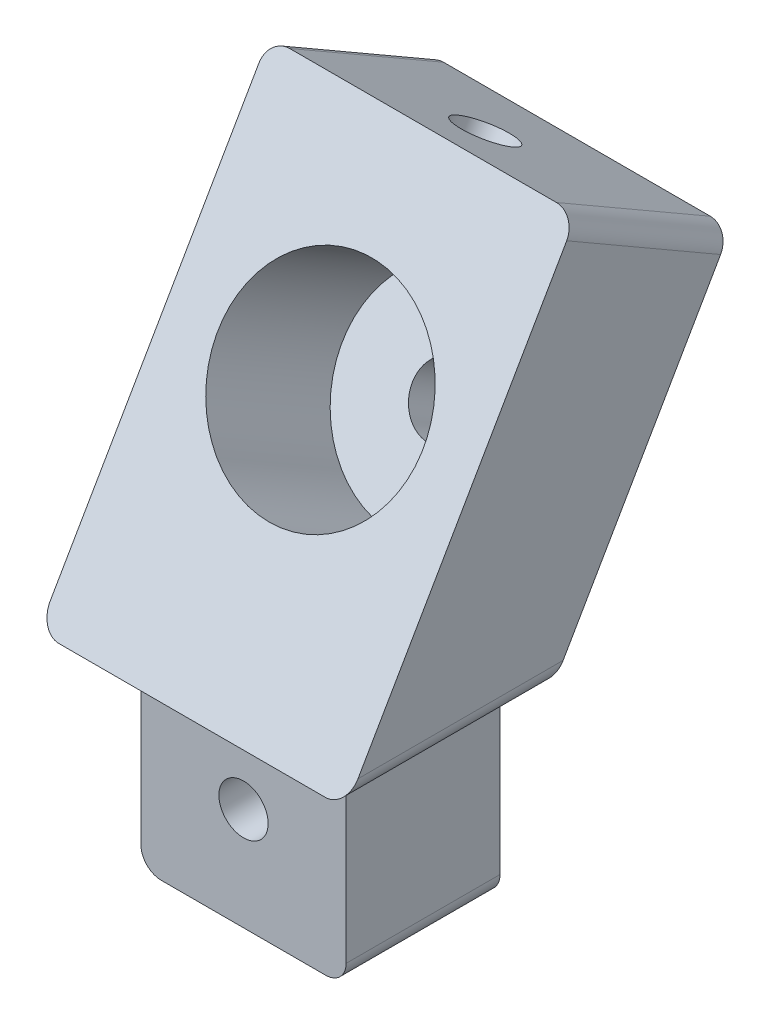
ISO-10303-21;
HEADER;
FILE_DESCRIPTION(('STEP AP214'),'2;1');
FILE_NAME('part.step','',(''),(''),'','','');
FILE_SCHEMA(('AUTOMOTIVE_DESIGN { 1 0 10303 214 1 1 1 1 }'));
ENDSEC;
DATA;
#1=APPLICATION_CONTEXT('core data for automotive mechanical design processes');
#2=APPLICATION_PROTOCOL_DEFINITION('international standard','automotive_design',2000,#1);
#3=PRODUCT_CONTEXT('',#1,'mechanical');
#4=PRODUCT('Part','Part','',(#3));
#5=PRODUCT_RELATED_PRODUCT_CATEGORY('part','',(#4));
#6=PRODUCT_DEFINITION_FORMATION('','',#4);
#7=PRODUCT_DEFINITION_CONTEXT('part definition',#1,'design');
#8=PRODUCT_DEFINITION('design','',#6,#7);
#9=PRODUCT_DEFINITION_SHAPE('','',#8);
#10=(LENGTH_UNIT() NAMED_UNIT(*) SI_UNIT(.MILLI.,.METRE.));
#11=(NAMED_UNIT(*) PLANE_ANGLE_UNIT() SI_UNIT($,.RADIAN.));
#12=(NAMED_UNIT(*) SI_UNIT($,.STERADIAN.) SOLID_ANGLE_UNIT());
#13=UNCERTAINTY_MEASURE_WITH_UNIT(LENGTH_MEASURE(1.E-05),#10,'distance_accuracy_value','');
#14=(GEOMETRIC_REPRESENTATION_CONTEXT(3) GLOBAL_UNCERTAINTY_ASSIGNED_CONTEXT((#13)) GLOBAL_UNIT_ASSIGNED_CONTEXT((#10,
#11,#12)) REPRESENTATION_CONTEXT('',''));
#15=CARTESIAN_POINT('',(0.,0.,0.));
#16=DIRECTION('',(0.,0.,1.));
#17=DIRECTION('',(1.,0.,0.));
#18=AXIS2_PLACEMENT_3D('',#15,#16,#17);
#19=CARTESIAN_POINT('',(5.,-5.,3.75));
#20=DIRECTION('',(-1.,0.,0.));
#21=DIRECTION('',(0.,0.,1.));
#22=AXIS2_PLACEMENT_3D('',#19,#20,#21);
#23=PLANE('',#22);
#24=DIRECTION('',(0.,1.,0.));
#25=VECTOR('',#24,1.);
#26=CARTESIAN_POINT('',(5.,-5.,3.75));
#27=LINE('',#26,#25);
#28=CARTESIAN_POINT('',(5.,-4.,3.75));
#29=VERTEX_POINT('',#28);
#30=CARTESIAN_POINT('',(5.,4.,3.75));
#31=VERTEX_POINT('',#30);
#32=EDGE_CURVE('E236',#29,#31,#27,.T.);
#33=ORIENTED_EDGE('',*,*,#32,.F.);
#34=DIRECTION('',(0.,0.,-1.));
#35=VECTOR('',#34,1.);
#36=CARTESIAN_POINT('',(5.,-4.,3.75));
#37=LINE('',#36,#35);
#38=CARTESIAN_POINT('',(5.,-4.,-3.75));
#39=VERTEX_POINT('',#38);
#40=EDGE_CURVE('E333',#29,#39,#37,.T.);
#41=ORIENTED_EDGE('',*,*,#40,.T.);
#42=DIRECTION('',(0.,1.,0.));
#43=VECTOR('',#42,1.);
#44=CARTESIAN_POINT('',(5.,-5.,-3.75));
#45=LINE('',#44,#43);
#46=CARTESIAN_POINT('',(5.,4.,-3.75));
#47=VERTEX_POINT('',#46);
#48=EDGE_CURVE('E230',#39,#47,#45,.T.);
#49=ORIENTED_EDGE('',*,*,#48,.T.);
#50=DIRECTION('',(0.,0.,-1.));
#51=VECTOR('',#50,1.);
#52=CARTESIAN_POINT('',(5.,4.,3.75));
#53=LINE('',#52,#51);
#54=EDGE_CURVE('E317',#47,#31,#53,.F.);
#55=ORIENTED_EDGE('',*,*,#54,.T.);
#56=EDGE_LOOP('',(#33,#41,#49,#55));
#57=FACE_BOUND('',#56,.T.);
#58=ADVANCED_FACE('F39',(#57),#23,.F.);
#59=CARTESIAN_POINT('',(-5.,-5.,3.75));
#60=DIRECTION('',(1.,0.,0.));
#61=DIRECTION('',(0.,0.,-1.));
#62=AXIS2_PLACEMENT_3D('',#59,#60,#61);
#63=PLANE('',#62);
#64=DIRECTION('',(0.,-1.,0.));
#65=VECTOR('',#64,1.);
#66=CARTESIAN_POINT('',(-5.,-5.,-3.75));
#67=LINE('',#66,#65);
#68=CARTESIAN_POINT('',(-5.,4.,-3.75));
#69=VERTEX_POINT('',#68);
#70=CARTESIAN_POINT('',(-5.,-4.,-3.75));
#71=VERTEX_POINT('',#70);
#72=EDGE_CURVE('E255',#69,#71,#67,.T.);
#73=ORIENTED_EDGE('',*,*,#72,.T.);
#74=DIRECTION('',(0.,0.,-1.));
#75=VECTOR('',#74,1.);
#76=CARTESIAN_POINT('',(-5.,-4.,3.75));
#77=LINE('',#76,#75);
#78=CARTESIAN_POINT('',(-5.,-4.,3.75));
#79=VERTEX_POINT('',#78);
#80=EDGE_CURVE('E356',#71,#79,#77,.F.);
#81=ORIENTED_EDGE('',*,*,#80,.T.);
#82=DIRECTION('',(0.,-1.,0.));
#83=VECTOR('',#82,1.);
#84=CARTESIAN_POINT('',(-5.,-5.,3.75));
#85=LINE('',#84,#83);
#86=CARTESIAN_POINT('',(-5.,4.,3.75));
#87=VERTEX_POINT('',#86);
#88=EDGE_CURVE('E240',#87,#79,#85,.T.);
#89=ORIENTED_EDGE('',*,*,#88,.F.);
#90=DIRECTION('',(0.,0.,-1.));
#91=VECTOR('',#90,1.);
#92=CARTESIAN_POINT('',(-5.,4.,-3.75));
#93=LINE('',#92,#91);
#94=EDGE_CURVE('E321',#87,#69,#93,.T.);
#95=ORIENTED_EDGE('',*,*,#94,.T.);
#96=EDGE_LOOP('',(#73,#81,#89,#95));
#97=FACE_BOUND('',#96,.T.);
#98=ADVANCED_FACE('F520',(#97),#63,.F.);
#99=CARTESIAN_POINT('',(-5.,-5.,3.75));
#100=DIRECTION('',(0.,1.,0.));
#101=DIRECTION('',(0.,0.,1.));
#102=AXIS2_PLACEMENT_3D('',#99,#100,#101);
#103=PLANE('',#102);
#104=DIRECTION('',(1.,0.,0.));
#105=VECTOR('',#104,1.);
#106=CARTESIAN_POINT('',(-5.,-5.,-3.75));
#107=LINE('',#106,#105);
#108=CARTESIAN_POINT('',(-4.,-5.,-3.75));
#109=VERTEX_POINT('',#108);
#110=CARTESIAN_POINT('',(4.,-5.,-3.75));
#111=VERTEX_POINT('',#110);
#112=EDGE_CURVE('E241',#109,#111,#107,.T.);
#113=ORIENTED_EDGE('',*,*,#112,.T.);
#114=DIRECTION('',(0.,0.,-1.));
#115=VECTOR('',#114,1.);
#116=CARTESIAN_POINT('',(4.,-5.,3.75));
#117=LINE('',#116,#115);
#118=CARTESIAN_POINT('',(4.,-5.,3.75));
#119=VERTEX_POINT('',#118);
#120=EDGE_CURVE('E347',#111,#119,#117,.F.);
#121=ORIENTED_EDGE('',*,*,#120,.T.);
#122=DIRECTION('',(1.,0.,0.));
#123=VECTOR('',#122,1.);
#124=CARTESIAN_POINT('',(-5.,-5.,3.75));
#125=LINE('',#124,#123);
#126=CARTESIAN_POINT('',(-4.,-5.,3.75));
#127=VERTEX_POINT('',#126);
#128=EDGE_CURVE('E245',#127,#119,#125,.T.);
#129=ORIENTED_EDGE('',*,*,#128,.F.);
#130=DIRECTION('',(0.,0.,-1.));
#131=VECTOR('',#130,1.);
#132=CARTESIAN_POINT('',(-4.,-5.,3.75));
#133=LINE('',#132,#131);
#134=EDGE_CURVE('E343',#127,#109,#133,.T.);
#135=ORIENTED_EDGE('',*,*,#134,.T.);
#136=EDGE_LOOP('',(#113,#121,#129,#135));
#137=FACE_BOUND('',#136,.T.);
#138=ADVANCED_FACE('F513',(#137),#103,.F.);
#139=CARTESIAN_POINT('',(0.,0.,3.75));
#140=DIRECTION('',(0.,0.,-1.));
#141=DIRECTION('',(-1.,0.,0.));
#142=AXIS2_PLACEMENT_3D('',#139,#140,#141);
#143=PLANE('',#142);
#144=CARTESIAN_POINT('',(0.,0.,3.75));
#145=DIRECTION('',(0.,0.,1.));
#146=DIRECTION('',(1.,0.,0.));
#147=AXIS2_PLACEMENT_3D('',#144,#145,#146);
#148=CIRCLE('',#147,1.2);
#149=CARTESIAN_POINT('',(1.2,0.,3.75));
#150=VERTEX_POINT('',#149);
#151=EDGE_CURVE('E425',#150,#150,#148,.T.);
#152=ORIENTED_EDGE('',*,*,#151,.F.);
#153=EDGE_LOOP('',(#152));
#154=FACE_BOUND('',#153,.T.);
#155=ORIENTED_EDGE('',*,*,#32,.T.);
#156=DIRECTION('',(-1.,0.,0.));
#157=VECTOR('',#156,1.);
#158=CARTESIAN_POINT('',(-6.,4.,3.75));
#159=LINE('',#158,#157);
#160=EDGE_CURVE('E359',#31,#87,#159,.T.);
#161=ORIENTED_EDGE('',*,*,#160,.T.);
#162=ORIENTED_EDGE('',*,*,#88,.T.);
#163=CARTESIAN_POINT('',(-4.,-4.,3.75));
#164=DIRECTION('',(0.,0.,-1.));
#165=DIRECTION('',(-1.,0.,0.));
#166=AXIS2_PLACEMENT_3D('',#163,#164,#165);
#167=CIRCLE('',#166,1.);
#168=EDGE_CURVE('E350',#79,#127,#167,.F.);
#169=ORIENTED_EDGE('',*,*,#168,.T.);
#170=ORIENTED_EDGE('',*,*,#128,.T.);
#171=CARTESIAN_POINT('',(4.,-4.,3.75));
#172=DIRECTION('',(0.,0.,-1.));
#173=DIRECTION('',(-1.,0.,0.));
#174=AXIS2_PLACEMENT_3D('',#171,#172,#173);
#175=CIRCLE('',#174,1.);
#176=EDGE_CURVE('E353',#119,#29,#175,.F.);
#177=ORIENTED_EDGE('',*,*,#176,.T.);
#178=EDGE_LOOP('',(#155,#161,#162,#169,#170,#177));
#179=FACE_BOUND('',#178,.T.);
#180=ADVANCED_FACE('F510',(#154,#179),#143,.F.);
#181=CARTESIAN_POINT('',(0.,0.,-3.75));
#182=DIRECTION('',(0.,0.,-1.));
#183=DIRECTION('',(-1.,0.,0.));
#184=AXIS2_PLACEMENT_3D('',#181,#182,#183);
#185=PLANE('',#184);
#186=DIRECTION('',(0.,1.,0.));
#187=VECTOR('',#186,1.);
#188=CARTESIAN_POINT('',(-3.25,-3.25,-3.75));
#189=LINE('',#188,#187);
#190=CARTESIAN_POINT('',(-3.25,-3.25,-3.75));
#191=VERTEX_POINT('',#190);
#192=CARTESIAN_POINT('',(-3.25,3.25,-3.75));
#193=VERTEX_POINT('',#192);
#194=EDGE_CURVE('E185',#191,#193,#189,.T.);
#195=ORIENTED_EDGE('',*,*,#194,.F.);
#196=DIRECTION('',(-1.,0.,0.));
#197=VECTOR('',#196,1.);
#198=CARTESIAN_POINT('',(3.25,-3.25,-3.75));
#199=LINE('',#198,#197);
#200=CARTESIAN_POINT('',(3.25,-3.25,-3.75));
#201=VERTEX_POINT('',#200);
#202=EDGE_CURVE('E205',#201,#191,#199,.T.);
#203=ORIENTED_EDGE('',*,*,#202,.F.);
#204=DIRECTION('',(0.,-1.,0.));
#205=VECTOR('',#204,1.);
#206=CARTESIAN_POINT('',(3.25,-3.25,-3.75));
#207=LINE('',#206,#205);
#208=CARTESIAN_POINT('',(3.25,3.25,-3.75));
#209=VERTEX_POINT('',#208);
#210=EDGE_CURVE('E209',#209,#201,#207,.T.);
#211=ORIENTED_EDGE('',*,*,#210,.F.);
#212=DIRECTION('',(1.,0.,0.));
#213=VECTOR('',#212,1.);
#214=CARTESIAN_POINT('',(3.25,3.25,-3.75));
#215=LINE('',#214,#213);
#216=EDGE_CURVE('E221',#193,#209,#215,.T.);
#217=ORIENTED_EDGE('',*,*,#216,.F.);
#218=EDGE_LOOP('',(#195,#203,#211,#217));
#219=FACE_BOUND('',#218,.T.);
#220=ORIENTED_EDGE('',*,*,#48,.F.);
#221=CARTESIAN_POINT('',(4.,-4.,-3.75));
#222=DIRECTION('',(0.,0.,-1.));
#223=DIRECTION('',(-1.,0.,0.));
#224=AXIS2_PLACEMENT_3D('',#221,#222,#223);
#225=CIRCLE('',#224,1.);
#226=EDGE_CURVE('E340',#39,#111,#225,.T.);
#227=ORIENTED_EDGE('',*,*,#226,.T.);
#228=ORIENTED_EDGE('',*,*,#112,.F.);
#229=CARTESIAN_POINT('',(-4.,-4.,-3.75));
#230=DIRECTION('',(0.,0.,-1.));
#231=DIRECTION('',(-1.,0.,0.));
#232=AXIS2_PLACEMENT_3D('',#229,#230,#231);
#233=CIRCLE('',#232,1.);
#234=EDGE_CURVE('E337',#109,#71,#233,.T.);
#235=ORIENTED_EDGE('',*,*,#234,.T.);
#236=ORIENTED_EDGE('',*,*,#72,.F.);
#237=CARTESIAN_POINT('',(-6.,4.,-3.75));
#238=DIRECTION('',(0.,0.,-1.));
#239=DIRECTION('',(-1.,0.,0.));
#240=AXIS2_PLACEMENT_3D('',#237,#238,#239);
#241=CIRCLE('',#240,1.);
#242=CARTESIAN_POINT('',(-6.,5.,-3.75));
#243=VERTEX_POINT('',#242);
#244=EDGE_CURVE('E329',#69,#243,#241,.F.);
#245=ORIENTED_EDGE('',*,*,#244,.T.);
#246=DIRECTION('',(-1.,0.,0.));
#247=VECTOR('',#246,1.);
#248=CARTESIAN_POINT('',(-5.,5.,-3.75));
#249=LINE('',#248,#247);
#250=CARTESIAN_POINT('',(6.,5.,-3.75));
#251=VERTEX_POINT('',#250);
#252=EDGE_CURVE('E252',#251,#243,#249,.T.);
#253=ORIENTED_EDGE('',*,*,#252,.F.);
#254=CARTESIAN_POINT('',(6.,4.,-3.75));
#255=DIRECTION('',(0.,0.,-1.));
#256=DIRECTION('',(-1.,0.,0.));
#257=AXIS2_PLACEMENT_3D('',#254,#255,#256);
#258=CIRCLE('',#257,1.);
#259=EDGE_CURVE('E325',#251,#47,#258,.F.);
#260=ORIENTED_EDGE('',*,*,#259,.T.);
#261=EDGE_LOOP('',(#220,#227,#228,#235,#236,#245,#253,#260));
#262=FACE_BOUND('',#261,.T.);
#263=ADVANCED_FACE('F509',(#219,#262),#185,.T.);
#264=CARTESIAN_POINT('',(-3.25,-3.25,1.25));
#265=DIRECTION('',(-1.,0.,0.));
#266=DIRECTION('',(0.,0.,1.));
#267=AXIS2_PLACEMENT_3D('',#264,#265,#266);
#268=PLANE('',#267);
#269=ORIENTED_EDGE('',*,*,#194,.T.);
#270=DIRECTION('',(0.,0.,-1.));
#271=VECTOR('',#270,1.);
#272=CARTESIAN_POINT('',(-3.25,3.25,1.25));
#273=LINE('',#272,#271);
#274=CARTESIAN_POINT('',(-3.25,3.25,1.25));
#275=VERTEX_POINT('',#274);
#276=EDGE_CURVE('E178',#275,#193,#273,.T.);
#277=ORIENTED_EDGE('',*,*,#276,.F.);
#278=DIRECTION('',(0.,1.,0.));
#279=VECTOR('',#278,1.);
#280=CARTESIAN_POINT('',(-3.25,-3.25,1.25));
#281=LINE('',#280,#279);
#282=CARTESIAN_POINT('',(-3.25,-3.25,1.25));
#283=VERTEX_POINT('',#282);
#284=EDGE_CURVE('E182',#283,#275,#281,.T.);
#285=ORIENTED_EDGE('',*,*,#284,.F.);
#286=DIRECTION('',(0.,0.,-1.));
#287=VECTOR('',#286,1.);
#288=CARTESIAN_POINT('',(-3.25,-3.25,1.25));
#289=LINE('',#288,#287);
#290=EDGE_CURVE('E227',#283,#191,#289,.T.);
#291=ORIENTED_EDGE('',*,*,#290,.T.);
#292=EDGE_LOOP('',(#269,#277,#285,#291));
#293=FACE_BOUND('',#292,.T.);
#294=ADVANCED_FACE('F180',(#293),#268,.F.);
#295=CARTESIAN_POINT('',(3.25,-3.25,1.25));
#296=DIRECTION('',(0.,-1.,0.));
#297=DIRECTION('',(0.,0.,-1.));
#298=AXIS2_PLACEMENT_3D('',#295,#296,#297);
#299=PLANE('',#298);
#300=ORIENTED_EDGE('',*,*,#202,.T.);
#301=ORIENTED_EDGE('',*,*,#290,.F.);
#302=DIRECTION('',(-1.,0.,0.));
#303=VECTOR('',#302,1.);
#304=CARTESIAN_POINT('',(3.25,-3.25,1.25));
#305=LINE('',#304,#303);
#306=CARTESIAN_POINT('',(3.25,-3.25,1.25));
#307=VERTEX_POINT('',#306);
#308=EDGE_CURVE('E191',#307,#283,#305,.T.);
#309=ORIENTED_EDGE('',*,*,#308,.F.);
#310=DIRECTION('',(0.,0.,-1.));
#311=VECTOR('',#310,1.);
#312=CARTESIAN_POINT('',(3.25,-3.25,1.25));
#313=LINE('',#312,#311);
#314=EDGE_CURVE('E231',#307,#201,#313,.T.);
#315=ORIENTED_EDGE('',*,*,#314,.T.);
#316=EDGE_LOOP('',(#300,#301,#309,#315));
#317=FACE_BOUND('',#316,.T.);
#318=ADVANCED_FACE('F497',(#317),#299,.F.);
#319=CARTESIAN_POINT('',(3.25,-3.25,1.25));
#320=DIRECTION('',(1.,0.,0.));
#321=DIRECTION('',(0.,0.,-1.));
#322=AXIS2_PLACEMENT_3D('',#319,#320,#321);
#323=PLANE('',#322);
#324=ORIENTED_EDGE('',*,*,#210,.T.);
#325=ORIENTED_EDGE('',*,*,#314,.F.);
#326=DIRECTION('',(0.,-1.,0.));
#327=VECTOR('',#326,1.);
#328=CARTESIAN_POINT('',(3.25,-3.25,1.25));
#329=LINE('',#328,#327);
#330=CARTESIAN_POINT('',(3.25,3.25,1.25));
#331=VERTEX_POINT('',#330);
#332=EDGE_CURVE('E200',#331,#307,#329,.T.);
#333=ORIENTED_EDGE('',*,*,#332,.F.);
#334=DIRECTION('',(0.,0.,-1.));
#335=VECTOR('',#334,1.);
#336=CARTESIAN_POINT('',(3.25,3.25,1.25));
#337=LINE('',#336,#335);
#338=EDGE_CURVE('E190',#331,#209,#337,.T.);
#339=ORIENTED_EDGE('',*,*,#338,.T.);
#340=EDGE_LOOP('',(#324,#325,#333,#339));
#341=FACE_BOUND('',#340,.T.);
#342=ADVANCED_FACE('F500',(#341),#323,.F.);
#343=CARTESIAN_POINT('',(3.25,3.25,1.25));
#344=DIRECTION('',(0.,1.,0.));
#345=DIRECTION('',(0.,0.,1.));
#346=AXIS2_PLACEMENT_3D('',#343,#344,#345);
#347=PLANE('',#346);
#348=ORIENTED_EDGE('',*,*,#216,.T.);
#349=ORIENTED_EDGE('',*,*,#338,.F.);
#350=DIRECTION('',(1.,0.,0.));
#351=VECTOR('',#350,1.);
#352=CARTESIAN_POINT('',(3.25,3.25,1.25));
#353=LINE('',#352,#351);
#354=EDGE_CURVE('E194',#275,#331,#353,.T.);
#355=ORIENTED_EDGE('',*,*,#354,.F.);
#356=ORIENTED_EDGE('',*,*,#276,.T.);
#357=EDGE_LOOP('',(#348,#349,#355,#356));
#358=FACE_BOUND('',#357,.T.);
#359=ADVANCED_FACE('F195',(#358),#347,.F.);
#360=CARTESIAN_POINT('',(0.,0.,1.25));
#361=DIRECTION('',(0.,0.,1.));
#362=DIRECTION('',(1.,0.,0.));
#363=AXIS2_PLACEMENT_3D('',#360,#361,#362);
#364=PLANE('',#363);
#365=CARTESIAN_POINT('',(0.,0.,1.25));
#366=DIRECTION('',(0.,0.,1.));
#367=DIRECTION('',(1.,0.,0.));
#368=AXIS2_PLACEMENT_3D('',#365,#366,#367);
#369=CIRCLE('',#368,1.2);
#370=CARTESIAN_POINT('',(1.2,0.,1.25));
#371=VERTEX_POINT('',#370);
#372=EDGE_CURVE('E415',#371,#371,#369,.T.);
#373=ORIENTED_EDGE('',*,*,#372,.T.);
#374=EDGE_LOOP('',(#373));
#375=FACE_BOUND('',#374,.T.);
#376=ORIENTED_EDGE('',*,*,#284,.T.);
#377=ORIENTED_EDGE('',*,*,#354,.T.);
#378=ORIENTED_EDGE('',*,*,#332,.T.);
#379=ORIENTED_EDGE('',*,*,#308,.T.);
#380=EDGE_LOOP('',(#376,#377,#378,#379));
#381=FACE_BOUND('',#380,.T.);
#382=ADVANCED_FACE('F202',(#375,#381),#364,.F.);
#383=CARTESIAN_POINT('',(7.5,5.,-3.75));
#384=DIRECTION('',(0.,1.,0.));
#385=DIRECTION('',(0.,0.,1.));
#386=AXIS2_PLACEMENT_3D('',#383,#384,#385);
#387=PLANE('',#386);
#388=DIRECTION('',(0.,0.,-1.));
#389=VECTOR('',#388,1.);
#390=CARTESIAN_POINT('',(-6.,5.,3.75));
#391=LINE('',#390,#389);
#392=CARTESIAN_POINT('',(-6.,5.,4.75));
#393=VERTEX_POINT('',#392);
#394=EDGE_CURVE('E55',#243,#393,#391,.F.);
#395=ORIENTED_EDGE('',*,*,#394,.T.);
#396=DIRECTION('',(-1.,0.,0.));
#397=VECTOR('',#396,1.);
#398=CARTESIAN_POINT('',(6.,5.,4.75));
#399=LINE('',#398,#397);
#400=CARTESIAN_POINT('',(6.,5.,4.75));
#401=VERTEX_POINT('',#400);
#402=EDGE_CURVE('E369',#393,#401,#399,.F.);
#403=ORIENTED_EDGE('',*,*,#402,.T.);
#404=DIRECTION('',(0.,0.,-1.));
#405=VECTOR('',#404,1.);
#406=CARTESIAN_POINT('',(6.,5.,-3.75));
#407=LINE('',#406,#405);
#408=EDGE_CURVE('E62',#401,#251,#407,.T.);
#409=ORIENTED_EDGE('',*,*,#408,.T.);
#410=DIRECTION('',(-1.,0.,0.));
#411=VECTOR('',#410,1.);
#412=CARTESIAN_POINT('',(7.5,5.,-3.75));
#413=LINE('',#412,#411);
#414=CARTESIAN_POINT('',(6.5,5.,-3.75));
#415=VERTEX_POINT('',#414);
#416=EDGE_CURVE('E212',#415,#251,#413,.T.);
#417=ORIENTED_EDGE('',*,*,#416,.F.);
#418=DIRECTION('',(0.,0.,-1.));
#419=VECTOR('',#418,1.);
#420=CARTESIAN_POINT('',(6.5,5.,-3.75));
#421=LINE('',#420,#419);
#422=CARTESIAN_POINT('',(6.5,5.,6.25));
#423=VERTEX_POINT('',#422);
#424=EDGE_CURVE('E285',#415,#423,#421,.F.);
#425=ORIENTED_EDGE('',*,*,#424,.T.);
#426=DIRECTION('',(-1.,0.,0.));
#427=VECTOR('',#426,1.);
#428=CARTESIAN_POINT('',(7.5,5.,6.25));
#429=LINE('',#428,#427);
#430=CARTESIAN_POINT('',(-6.5,5.,6.25));
#431=VERTEX_POINT('',#430);
#432=EDGE_CURVE('E399',#423,#431,#429,.T.);
#433=ORIENTED_EDGE('',*,*,#432,.T.);
#434=DIRECTION('',(0.,0.,-1.));
#435=VECTOR('',#434,1.);
#436=CARTESIAN_POINT('',(-6.5,5.,-3.75));
#437=LINE('',#436,#435);
#438=CARTESIAN_POINT('',(-6.5,5.,-3.75));
#439=VERTEX_POINT('',#438);
#440=EDGE_CURVE('E281',#431,#439,#437,.T.);
#441=ORIENTED_EDGE('',*,*,#440,.T.);
#442=EDGE_CURVE('E387',#243,#439,#413,.T.);
#443=ORIENTED_EDGE('',*,*,#442,.F.);
#444=EDGE_LOOP('',(#395,#403,#409,#417,#425,#433,#441,#443));
#445=FACE_BOUND('',#444,.T.);
#446=ADVANCED_FACE('F379',(#445),#387,.F.);
#447=CARTESIAN_POINT('',(7.5,20.1554445662276,-12.5000000000001));
#448=DIRECTION('',(0.,0.500000000000004,0.866025403784436));
#449=DIRECTION('',(0.,-0.866025403784436,0.500000000000004));
#450=AXIS2_PLACEMENT_3D('',#447,#448,#449);
#451=PLANE('',#450);
#452=CARTESIAN_POINT('',(0.,11.4951905283833,-7.50000000000003));
#453=DIRECTION('',(0.,-0.500000000000004,-0.866025403784437));
#454=DIRECTION('',(0.,0.866025403784437,-0.500000000000004));
#455=AXIS2_PLACEMENT_3D('',#452,#453,#454);
#456=CIRCLE('',#455,1.5875);
#457=CARTESIAN_POINT('',(0.,12.8700058568911,-8.29375000000003));
#458=VERTEX_POINT('',#457);
#459=EDGE_CURVE('E365',#458,#458,#456,.T.);
#460=ORIENTED_EDGE('',*,*,#459,.F.);
#461=EDGE_LOOP('',(#460));
#462=FACE_BOUND('',#461,.T.);
#463=DIRECTION('',(0.,0.866025403784436,-0.500000000000004));
#464=VECTOR('',#463,1.);
#465=CARTESIAN_POINT('',(7.5,20.1554445662276,-12.5000000000001));
#466=LINE('',#465,#464);
#467=CARTESIAN_POINT('',(7.5,6.,-4.32735026918963));
#468=VERTEX_POINT('',#467);
#469=CARTESIAN_POINT('',(7.5,19.2894191624432,-12.0000000000001));
#470=VERTEX_POINT('',#469);
#471=EDGE_CURVE('E410',#468,#470,#466,.T.);
#472=ORIENTED_EDGE('',*,*,#471,.F.);
#473=CARTESIAN_POINT('',(6.5,6.,-4.32735026918963));
#474=DIRECTION('',(0.,0.500000000000004,0.866025403784436));
#475=DIRECTION('',(0.,0.866025403784436,-0.500000000000004));
#476=AXIS2_PLACEMENT_3D('',#473,#474,#475);
#477=ELLIPSE('',#476,1.15470053837925,1.);
#478=EDGE_CURVE('E278',#468,#415,#477,.F.);
#479=ORIENTED_EDGE('',*,*,#478,.T.);
#480=ORIENTED_EDGE('',*,*,#416,.T.);
#481=ORIENTED_EDGE('',*,*,#252,.T.);
#482=ORIENTED_EDGE('',*,*,#442,.T.);
#483=CARTESIAN_POINT('',(-6.5,6.,-4.32735026918963));
#484=DIRECTION('',(0.,0.500000000000004,0.866025403784436));
#485=DIRECTION('',(0.,-0.866025403784436,0.500000000000004));
#486=AXIS2_PLACEMENT_3D('',#483,#484,#485);
#487=ELLIPSE('',#486,1.15470053837925,1.);
#488=CARTESIAN_POINT('',(-7.5,6.,-4.32735026918963));
#489=VERTEX_POINT('',#488);
#490=EDGE_CURVE('E272',#439,#489,#487,.F.);
#491=ORIENTED_EDGE('',*,*,#490,.T.);
#492=DIRECTION('',(0.,0.866025403784436,-0.500000000000004));
#493=VECTOR('',#492,1.);
#494=CARTESIAN_POINT('',(-7.5,20.1554445662276,-12.5000000000001));
#495=LINE('',#494,#493);
#496=CARTESIAN_POINT('',(-7.5,19.2894191624432,-12.0000000000001));
#497=VERTEX_POINT('',#496);
#498=EDGE_CURVE('E411',#489,#497,#495,.T.);
#499=ORIENTED_EDGE('',*,*,#498,.T.);
#500=CARTESIAN_POINT('',(-6.5,19.2894191624432,-12.0000000000001));
#501=DIRECTION('',(0.,0.500000000000004,0.866025403784436));
#502=DIRECTION('',(0.,-0.866025403784436,0.500000000000004));
#503=AXIS2_PLACEMENT_3D('',#500,#501,#502);
#504=CIRCLE('',#503,1.);
#505=CARTESIAN_POINT('',(-6.5,20.1554445662276,-12.5000000000001));
#506=VERTEX_POINT('',#505);
#507=EDGE_CURVE('E269',#497,#506,#504,.F.);
#508=ORIENTED_EDGE('',*,*,#507,.T.);
#509=DIRECTION('',(-1.,0.,0.));
#510=VECTOR('',#509,1.);
#511=CARTESIAN_POINT('',(7.5,20.1554445662276,-12.5000000000001));
#512=LINE('',#511,#510);
#513=CARTESIAN_POINT('',(6.5,20.1554445662276,-12.5000000000001));
#514=VERTEX_POINT('',#513);
#515=EDGE_CURVE('E389',#514,#506,#512,.T.);
#516=ORIENTED_EDGE('',*,*,#515,.F.);
#517=CARTESIAN_POINT('',(6.5,19.2894191624432,-12.0000000000001));
#518=DIRECTION('',(0.,0.500000000000004,0.866025403784436));
#519=DIRECTION('',(0.,-0.866025403784436,0.500000000000004));
#520=AXIS2_PLACEMENT_3D('',#517,#518,#519);
#521=CIRCLE('',#520,1.);
#522=EDGE_CURVE('E275',#514,#470,#521,.F.);
#523=ORIENTED_EDGE('',*,*,#522,.T.);
#524=EDGE_LOOP('',(#472,#479,#480,#481,#482,#491,#499,#508,#516,#523));
#525=FACE_BOUND('',#524,.T.);
#526=ADVANCED_FACE('F385',(#462,#525),#451,.F.);
#527=CARTESIAN_POINT('',(7.5,24.4855715851499,-5.00000000000011));
#528=DIRECTION('',(0.,-0.866025403784436,0.500000000000004));
#529=DIRECTION('',(0.,-0.500000000000004,-0.866025403784436));
#530=AXIS2_PLACEMENT_3D('',#527,#528,#529);
#531=PLANE('',#530);
#532=CARTESIAN_POINT('',(0.,22.7355715851498,-8.03108891324565));
#533=DIRECTION('',(0.,0.866025403784437,-0.500000000000004));
#534=DIRECTION('',(0.,0.500000000000004,0.866025403784437));
#535=AXIS2_PLACEMENT_3D('',#532,#533,#534);
#536=CIRCLE('',#535,1.35);
#537=CARTESIAN_POINT('',(0.,23.4105715851498,-6.86195461813666));
#538=VERTEX_POINT('',#537);
#539=EDGE_CURVE('E440',#538,#538,#536,.T.);
#540=ORIENTED_EDGE('',*,*,#539,.F.);
#541=EDGE_LOOP('',(#540));
#542=FACE_BOUND('',#541,.T.);
#543=DIRECTION('',(-1.,0.,0.));
#544=VECTOR('',#543,1.);
#545=CARTESIAN_POINT('',(7.5,24.4855715851499,-5.00000000000011));
#546=LINE('',#545,#544);
#547=CARTESIAN_POINT('',(6.5,24.4855715851499,-5.00000000000011));
#548=VERTEX_POINT('',#547);
#549=CARTESIAN_POINT('',(-6.5,24.4855715851499,-5.00000000000011));
#550=VERTEX_POINT('',#549);
#551=EDGE_CURVE('E393',#548,#550,#546,.T.);
#552=ORIENTED_EDGE('',*,*,#551,.F.);
#553=DIRECTION('',(0.,0.500000000000004,0.866025403784436));
#554=VECTOR('',#553,1.);
#555=CARTESIAN_POINT('',(6.5,24.4855715851499,-5.00000000000011));
#556=LINE('',#555,#554);
#557=EDGE_CURVE('E304',#548,#514,#556,.F.);
#558=ORIENTED_EDGE('',*,*,#557,.T.);
#559=ORIENTED_EDGE('',*,*,#515,.T.);
#560=DIRECTION('',(0.,0.500000000000004,0.866025403784436));
#561=VECTOR('',#560,1.);
#562=CARTESIAN_POINT('',(-6.5,24.4855715851499,-5.00000000000011));
#563=LINE('',#562,#561);
#564=EDGE_CURVE('E300',#506,#550,#563,.T.);
#565=ORIENTED_EDGE('',*,*,#564,.T.);
#566=EDGE_LOOP('',(#552,#558,#559,#565));
#567=FACE_BOUND('',#566,.T.);
#568=ADVANCED_FACE('F484',(#542,#567),#531,.F.);
#569=CARTESIAN_POINT('',(7.5,5.,6.25));
#570=DIRECTION('',(0.,-0.500000000000004,-0.866025403784436));
#571=DIRECTION('',(0.,0.866025403784436,-0.500000000000004));
#572=AXIS2_PLACEMENT_3D('',#569,#570,#571);
#573=PLANE('',#572);
#574=CARTESIAN_POINT('',(0.,15.8253175473055,0.));
#575=DIRECTION('',(0.,0.500000000000004,0.866025403784436));
#576=DIRECTION('',(0.,-0.866025403784436,0.500000000000004));
#577=AXIS2_PLACEMENT_3D('',#574,#575,#576);
#578=CIRCLE('',#577,5.);
#579=CARTESIAN_POINT('',(0.,11.4951905283833,2.49999999999995));
#580=VERTEX_POINT('',#579);
#581=EDGE_CURVE('E364',#580,#580,#578,.T.);
#582=ORIENTED_EDGE('',*,*,#581,.F.);
#583=EDGE_LOOP('',(#582));
#584=FACE_BOUND('',#583,.T.);
#585=ORIENTED_EDGE('',*,*,#432,.F.);
#586=CARTESIAN_POINT('',(6.5,6.,5.67264973081037));
#587=DIRECTION('',(0.,-0.500000000000004,-0.866025403784436));
#588=DIRECTION('',(0.,0.866025403784436,-0.500000000000004));
#589=AXIS2_PLACEMENT_3D('',#586,#587,#588);
#590=ELLIPSE('',#589,1.15470053837925,1.);
#591=CARTESIAN_POINT('',(7.5,6.,5.67264973081037));
#592=VERTEX_POINT('',#591);
#593=EDGE_CURVE('E297',#423,#592,#590,.F.);
#594=ORIENTED_EDGE('',*,*,#593,.T.);
#595=DIRECTION('',(0.,-0.866025403784436,0.500000000000004));
#596=VECTOR('',#595,1.);
#597=CARTESIAN_POINT('',(7.5,5.,6.25));
#598=LINE('',#597,#596);
#599=CARTESIAN_POINT('',(7.5,23.6195461813654,-4.5000000000001));
#600=VERTEX_POINT('',#599);
#601=EDGE_CURVE('E405',#600,#592,#598,.T.);
#602=ORIENTED_EDGE('',*,*,#601,.F.);
#603=CARTESIAN_POINT('',(6.5,23.6195461813654,-4.50000000000011));
#604=DIRECTION('',(0.,-0.500000000000004,-0.866025403784436));
#605=DIRECTION('',(0.,0.866025403784436,-0.500000000000004));
#606=AXIS2_PLACEMENT_3D('',#603,#604,#605);
#607=CIRCLE('',#606,1.);
#608=EDGE_CURVE('E294',#600,#548,#607,.F.);
#609=ORIENTED_EDGE('',*,*,#608,.T.);
#610=ORIENTED_EDGE('',*,*,#551,.T.);
#611=CARTESIAN_POINT('',(-6.5,23.6195461813654,-4.50000000000011));
#612=DIRECTION('',(0.,-0.500000000000004,-0.866025403784436));
#613=DIRECTION('',(0.,0.866025403784436,-0.500000000000004));
#614=AXIS2_PLACEMENT_3D('',#611,#612,#613);
#615=CIRCLE('',#614,1.);
#616=CARTESIAN_POINT('',(-7.5,23.6195461813654,-4.5000000000001));
#617=VERTEX_POINT('',#616);
#618=EDGE_CURVE('E288',#550,#617,#615,.F.);
#619=ORIENTED_EDGE('',*,*,#618,.T.);
#620=DIRECTION('',(0.,-0.866025403784436,0.500000000000004));
#621=VECTOR('',#620,1.);
#622=CARTESIAN_POINT('',(-7.5,5.,6.25));
#623=LINE('',#622,#621);
#624=CARTESIAN_POINT('',(-7.5,6.,5.67264973081037));
#625=VERTEX_POINT('',#624);
#626=EDGE_CURVE('E406',#617,#625,#623,.T.);
#627=ORIENTED_EDGE('',*,*,#626,.T.);
#628=CARTESIAN_POINT('',(-6.5,6.,5.67264973081037));
#629=DIRECTION('',(0.,-0.500000000000004,-0.866025403784436));
#630=DIRECTION('',(0.,-0.866025403784436,0.500000000000004));
#631=AXIS2_PLACEMENT_3D('',#628,#629,#630);
#632=ELLIPSE('',#631,1.15470053837925,1.);
#633=EDGE_CURVE('E291',#625,#431,#632,.F.);
#634=ORIENTED_EDGE('',*,*,#633,.T.);
#635=EDGE_LOOP('',(#585,#594,#602,#609,#610,#619,#627,#634));
#636=FACE_BOUND('',#635,.T.);
#637=ADVANCED_FACE('F477',(#584,#636),#573,.F.);
#638=CARTESIAN_POINT('',(7.5,0.,0.));
#639=DIRECTION('',(-1.,0.,0.));
#640=DIRECTION('',(0.,0.,1.));
#641=AXIS2_PLACEMENT_3D('',#638,#639,#640);
#642=PLANE('',#641);
#643=ORIENTED_EDGE('',*,*,#601,.T.);
#644=DIRECTION('',(0.,0.,-1.));
#645=VECTOR('',#644,1.);
#646=CARTESIAN_POINT('',(7.5,6.,0.));
#647=LINE('',#646,#645);
#648=EDGE_CURVE('E265',#592,#468,#647,.T.);
#649=ORIENTED_EDGE('',*,*,#648,.T.);
#650=ORIENTED_EDGE('',*,*,#471,.T.);
#651=DIRECTION('',(0.,0.500000000000004,0.866025403784436));
#652=VECTOR('',#651,1.);
#653=CARTESIAN_POINT('',(7.5,19.663216794539,-11.3525635094612));
#654=LINE('',#653,#652);
#655=EDGE_CURVE('E249',#470,#600,#654,.T.);
#656=ORIENTED_EDGE('',*,*,#655,.T.);
#657=EDGE_LOOP('',(#643,#649,#650,#656));
#658=FACE_BOUND('',#657,.T.);
#659=ADVANCED_FACE('F474',(#658),#642,.F.);
#660=CARTESIAN_POINT('',(-7.5,0.,0.));
#661=DIRECTION('',(-1.,0.,0.));
#662=DIRECTION('',(0.,0.,1.));
#663=AXIS2_PLACEMENT_3D('',#660,#661,#662);
#664=PLANE('',#663);
#665=ORIENTED_EDGE('',*,*,#498,.F.);
#666=DIRECTION('',(0.,0.,-1.));
#667=VECTOR('',#666,1.);
#668=CARTESIAN_POINT('',(-7.5,6.,6.25));
#669=LINE('',#668,#667);
#670=EDGE_CURVE('E310',#489,#625,#669,.F.);
#671=ORIENTED_EDGE('',*,*,#670,.T.);
#672=ORIENTED_EDGE('',*,*,#626,.F.);
#673=DIRECTION('',(0.,0.500000000000004,0.866025403784436));
#674=VECTOR('',#673,1.);
#675=CARTESIAN_POINT('',(-7.5,19.2894191624432,-12.0000000000001));
#676=LINE('',#675,#674);
#677=EDGE_CURVE('E307',#617,#497,#676,.F.);
#678=ORIENTED_EDGE('',*,*,#677,.T.);
#679=EDGE_LOOP('',(#665,#671,#672,#678));
#680=FACE_BOUND('',#679,.T.);
#681=ADVANCED_FACE('F472',(#680),#664,.T.);
#682=CARTESIAN_POINT('',(0.,0.,3.75));
#683=DIRECTION('',(0.,0.,1.));
#684=DIRECTION('',(1.,0.,0.));
#685=AXIS2_PLACEMENT_3D('',#682,#683,#684);
#686=CYLINDRICAL_SURFACE('',#685,1.2);
#687=ORIENTED_EDGE('',*,*,#151,.T.);
#688=EDGE_LOOP('',(#687));
#689=FACE_BOUND('',#688,.T.);
#690=ORIENTED_EDGE('',*,*,#372,.F.);
#691=EDGE_LOOP('',(#690));
#692=FACE_BOUND('',#691,.T.);
#693=ADVANCED_FACE('F468',(#689,#692),#686,.F.);
#694=CARTESIAN_POINT('',(6.5,6.,0.));
#695=DIRECTION('',(0.,0.,-1.));
#696=DIRECTION('',(0.,1.,0.));
#697=AXIS2_PLACEMENT_3D('',#694,#695,#696);
#698=CYLINDRICAL_SURFACE('',#697,1.);
#699=ORIENTED_EDGE('',*,*,#593,.F.);
#700=ORIENTED_EDGE('',*,*,#424,.F.);
#701=ORIENTED_EDGE('',*,*,#478,.F.);
#702=ORIENTED_EDGE('',*,*,#648,.F.);
#703=EDGE_LOOP('',(#699,#700,#701,#702));
#704=FACE_BOUND('',#703,.T.);
#705=ADVANCED_FACE('F471',(#704),#698,.T.);
#706=CARTESIAN_POINT('',(6.5,19.663216794539,-11.3525635094612));
#707=DIRECTION('',(0.,0.500000000000004,0.866025403784436));
#708=DIRECTION('',(0.,-0.866025403784436,0.500000000000004));
#709=AXIS2_PLACEMENT_3D('',#706,#707,#708);
#710=CYLINDRICAL_SURFACE('',#709,1.);
#711=ORIENTED_EDGE('',*,*,#522,.F.);
#712=ORIENTED_EDGE('',*,*,#557,.F.);
#713=ORIENTED_EDGE('',*,*,#608,.F.);
#714=ORIENTED_EDGE('',*,*,#655,.F.);
#715=EDGE_LOOP('',(#711,#712,#713,#714));
#716=FACE_BOUND('',#715,.T.);
#717=ADVANCED_FACE('F530',(#716),#710,.T.);
#718=CARTESIAN_POINT('',(-6.5,6.,-3.75));
#719=DIRECTION('',(0.,0.,1.));
#720=DIRECTION('',(0.,-1.,0.));
#721=AXIS2_PLACEMENT_3D('',#718,#719,#720);
#722=CYLINDRICAL_SURFACE('',#721,1.);
#723=ORIENTED_EDGE('',*,*,#633,.F.);
#724=ORIENTED_EDGE('',*,*,#670,.F.);
#725=ORIENTED_EDGE('',*,*,#490,.F.);
#726=ORIENTED_EDGE('',*,*,#440,.F.);
#727=EDGE_LOOP('',(#723,#724,#725,#726));
#728=FACE_BOUND('',#727,.T.);
#729=ADVANCED_FACE('F534',(#728),#722,.T.);
#730=CARTESIAN_POINT('',(-6.5,23.6195461813654,-4.5000000000001));
#731=DIRECTION('',(0.,-0.500000000000004,-0.866025403784436));
#732=DIRECTION('',(0.,0.866025403784436,-0.500000000000004));
#733=AXIS2_PLACEMENT_3D('',#730,#731,#732);
#734=CYLINDRICAL_SURFACE('',#733,1.);
#735=ORIENTED_EDGE('',*,*,#507,.F.);
#736=ORIENTED_EDGE('',*,*,#677,.F.);
#737=ORIENTED_EDGE('',*,*,#618,.F.);
#738=ORIENTED_EDGE('',*,*,#564,.F.);
#739=EDGE_LOOP('',(#735,#736,#737,#738));
#740=FACE_BOUND('',#739,.T.);
#741=ADVANCED_FACE('F538',(#740),#734,.T.);
#742=CARTESIAN_POINT('',(6.,4.,-3.75));
#743=DIRECTION('',(0.,0.,1.));
#744=DIRECTION('',(0.,-1.,0.));
#745=AXIS2_PLACEMENT_3D('',#742,#743,#744);
#746=CYLINDRICAL_SURFACE('',#745,1.);
#747=ORIENTED_EDGE('',*,*,#408,.F.);
#748=CARTESIAN_POINT('',(6.,4.,4.75));
#749=DIRECTION('',(-0.707106781186547,0.,0.707106781186547));
#750=DIRECTION('',(0.707106781186547,0.,0.707106781186547));
#751=AXIS2_PLACEMENT_3D('',#748,#749,#750);
#752=ELLIPSE('',#751,1.41421356237309,1.);
#753=EDGE_CURVE('E11',#401,#31,#752,.T.);
#754=ORIENTED_EDGE('',*,*,#753,.T.);
#755=ORIENTED_EDGE('',*,*,#54,.F.);
#756=ORIENTED_EDGE('',*,*,#259,.F.);
#757=EDGE_LOOP('',(#747,#754,#755,#756));
#758=FACE_BOUND('',#757,.T.);
#759=ADVANCED_FACE('F542',(#758),#746,.F.);
#760=CARTESIAN_POINT('',(-6.,4.,3.75));
#761=DIRECTION('',(0.,0.,1.));
#762=DIRECTION('',(0.,-1.,0.));
#763=AXIS2_PLACEMENT_3D('',#760,#761,#762);
#764=CYLINDRICAL_SURFACE('',#763,1.);
#765=ORIENTED_EDGE('',*,*,#94,.F.);
#766=CARTESIAN_POINT('',(-6.,4.,4.75));
#767=DIRECTION('',(0.707106781186547,0.,0.707106781186547));
#768=DIRECTION('',(-0.707106781186547,0.,0.707106781186547));
#769=AXIS2_PLACEMENT_3D('',#766,#767,#768);
#770=ELLIPSE('',#769,1.41421356237309,1.);
#771=EDGE_CURVE('E48',#87,#393,#770,.T.);
#772=ORIENTED_EDGE('',*,*,#771,.T.);
#773=ORIENTED_EDGE('',*,*,#394,.F.);
#774=ORIENTED_EDGE('',*,*,#244,.F.);
#775=EDGE_LOOP('',(#765,#772,#773,#774));
#776=FACE_BOUND('',#775,.T.);
#777=ADVANCED_FACE('F375',(#776),#764,.F.);
#778=CARTESIAN_POINT('',(4.,-4.,3.75));
#779=DIRECTION('',(0.,0.,-1.));
#780=DIRECTION('',(-1.,0.,0.));
#781=AXIS2_PLACEMENT_3D('',#778,#779,#780);
#782=CYLINDRICAL_SURFACE('',#781,1.);
#783=ORIENTED_EDGE('',*,*,#176,.F.);
#784=ORIENTED_EDGE('',*,*,#120,.F.);
#785=ORIENTED_EDGE('',*,*,#226,.F.);
#786=ORIENTED_EDGE('',*,*,#40,.F.);
#787=EDGE_LOOP('',(#783,#784,#785,#786));
#788=FACE_BOUND('',#787,.T.);
#789=ADVANCED_FACE('F548',(#788),#782,.T.);
#790=CARTESIAN_POINT('',(-4.,-4.,3.75));
#791=DIRECTION('',(0.,0.,-1.));
#792=DIRECTION('',(-1.,0.,0.));
#793=AXIS2_PLACEMENT_3D('',#790,#791,#792);
#794=CYLINDRICAL_SURFACE('',#793,1.);
#795=ORIENTED_EDGE('',*,*,#168,.F.);
#796=ORIENTED_EDGE('',*,*,#80,.F.);
#797=ORIENTED_EDGE('',*,*,#234,.F.);
#798=ORIENTED_EDGE('',*,*,#134,.F.);
#799=EDGE_LOOP('',(#795,#796,#797,#798));
#800=FACE_BOUND('',#799,.T.);
#801=ADVANCED_FACE('F466',(#800),#794,.T.);
#802=CARTESIAN_POINT('',(0.,12.3253175473055,-6.06217782649112));
#803=DIRECTION('',(0.,0.500000000000004,0.866025403784436));
#804=DIRECTION('',(0.,-0.866025403784436,0.500000000000004));
#805=AXIS2_PLACEMENT_3D('',#802,#803,#804);
#806=CYLINDRICAL_SURFACE('',#805,5.);
#807=CARTESIAN_POINT('',(0.,19.0804445662277,-4.36195461813664));
#808=CARTESIAN_POINT('',(-0.0743873307695947,19.0804427786993,-4.3619555413372));
#809=CARTESIAN_POINT('',(-0.148792666769753,19.0759083670988,-4.366458874195));
#810=CARTESIAN_POINT('',(-0.29545768867606,19.0580313699517,-4.38438249999021));
#811=CARTESIAN_POINT('',(-0.367716363591555,19.0446847008143,-4.39780692697199));
#812=CARTESIAN_POINT('',(-0.507949985812648,19.0099661151867,-4.43328575692853));
#813=CARTESIAN_POINT('',(-0.575930398976633,18.9886046917214,-4.45532887777433));
#814=CARTESIAN_POINT('',(-0.705933569976625,18.9389905810328,-4.5076590436263));
#815=CARTESIAN_POINT('',(-0.7679558908232,18.9107373888776,-4.53794669269431));
#816=CARTESIAN_POINT('',(-0.885753372872381,18.8480639726033,-4.60702800639769));
#817=CARTESIAN_POINT('',(-0.941367090298973,18.8135250747274,-4.64598930301793));
#818=CARTESIAN_POINT('',(-1.04336342950155,18.7403455919526,-4.73143365867542));
#819=CARTESIAN_POINT('',(-1.08974483095189,18.7017044658556,-4.77791771059862));
#820=CARTESIAN_POINT('',(-1.17275297020404,18.6213519795673,-4.87854675403459));
#821=CARTESIAN_POINT('',(-1.20919290946662,18.5795984403952,-4.93281257534048));
#822=CARTESIAN_POINT('',(-1.27008015096069,18.4955096196352,-5.04729742019774));
#823=CARTESIAN_POINT('',(-1.294529726486,18.4531744498865,-5.10751531267236));
#824=CARTESIAN_POINT('',(-1.33017946655856,18.3706705718554,-5.23102031948874));
#825=CARTESIAN_POINT('',(-1.34167282498482,18.3304744056816,-5.29420431549008));
#826=CARTESIAN_POINT('',(-1.35199810512328,18.2526916283548,-5.42315297381743));
#827=CARTESIAN_POINT('',(-1.35083245721694,18.2151045176879,-5.48891713836554));
#828=CARTESIAN_POINT('',(-1.3361053417256,18.1446728837478,-5.61912215511891));
#829=CARTESIAN_POINT('',(-1.32289980189411,18.1117233728612,-5.683546972713));
#830=CARTESIAN_POINT('',(-1.28503829760367,18.0499528579572,-5.81099108333355));
#831=CARTESIAN_POINT('',(-1.26038139750194,18.0211321915423,-5.87401026107001));
#832=CARTESIAN_POINT('',(-1.20002976537995,17.9675728698381,-5.99741999157399));
#833=CARTESIAN_POINT('',(-1.16421115470492,17.9428850618789,-6.05777190120764));
#834=CARTESIAN_POINT('',(-1.08263924483835,17.8979645947893,-6.17319239866733));
#835=CARTESIAN_POINT('',(-1.036883945768,17.8777328341456,-6.22825991972465));
#836=CARTESIAN_POINT('',(-0.934922547932879,17.8409075782363,-6.3330918788241));
#837=CARTESIAN_POINT('',(-0.878417879194191,17.8244585462893,-6.38261708673886));
#838=CARTESIAN_POINT('',(-0.757509820004862,17.7957782746269,-6.47239013380245));
#839=CARTESIAN_POINT('',(-0.693106102725515,17.7835472095127,-6.51263758887918));
#840=CARTESIAN_POINT('',(-0.557788338180539,17.7629435762926,-6.5824517921415));
#841=CARTESIAN_POINT('',(-0.486846038089127,17.7545887935357,-6.61196917674576));
#842=CARTESIAN_POINT('',(-0.340718832169033,17.7415709305923,-6.65878275939552));
#843=CARTESIAN_POINT('',(-0.265534881605184,17.7369070227089,-6.6760816973944));
#844=CARTESIAN_POINT('',(-0.115442229132923,17.731201452265,-6.6973413277577));
#845=CARTESIAN_POINT('',(-0.0405910513906099,17.7300568193111,-6.70168108034056));
#846=CARTESIAN_POINT('',(0.108768453767013,17.7310614932868,-6.69790356353058));
#847=CARTESIAN_POINT('',(0.18327681673725,17.7332104505294,-6.68978761658361));
#848=CARTESIAN_POINT('',(0.328472841214747,17.7408017290035,-6.66172322506397));
#849=CARTESIAN_POINT('',(0.399204758879306,17.7461851627442,-6.64198647670542));
#850=CARTESIAN_POINT('',(0.536338135887881,17.760352877732,-6.59167730718828));
#851=CARTESIAN_POINT('',(0.602739119097061,17.769137532169,-6.56110369701479));
#852=CARTESIAN_POINT('',(0.73079396847791,17.7905535475685,-6.48958415254531));
#853=CARTESIAN_POINT('',(0.792326673846137,17.8032581672753,-6.44844342403507));
#854=CARTESIAN_POINT('',(0.907606958866453,17.8327470215589,-6.3575972306295));
#855=CARTESIAN_POINT('',(0.961352956778543,17.8495320831605,-6.3078900300754));
#856=CARTESIAN_POINT('',(1.06114152791564,17.8880244963085,-6.20003534281189));
#857=CARTESIAN_POINT('',(1.10691588962313,17.9098603363215,-6.1416850910212));
#858=CARTESIAN_POINT('',(1.18750993848367,17.9583726015396,-6.0196651195402));
#859=CARTESIAN_POINT('',(1.22233007294467,17.9850488290209,-5.95599561719204));
#860=CARTESIAN_POINT('',(1.27976571195376,18.0430467770357,-5.82585435337392));
#861=CARTESIAN_POINT('',(1.3024511379558,18.07434052783,-5.75940107869951));
#862=CARTESIAN_POINT('',(1.3351337158999,18.1412841400092,-5.6255800964623));
#863=CARTESIAN_POINT('',(1.34513421032658,18.1769328511449,-5.55821263451895));
#864=CARTESIAN_POINT('',(1.3519672693509,18.25047048542,-5.42701316329129));
#865=CARTESIAN_POINT('',(1.34923145853838,18.2882437161921,-5.36313845554577));
#866=CARTESIAN_POINT('',(1.33167355415244,18.3658977267304,-5.23840897835626));
#867=CARTESIAN_POINT('',(1.31685178658213,18.4057784496226,-5.17755412750249));
#868=CARTESIAN_POINT('',(1.27579582117767,18.4858725957329,-5.06086571265733));
#869=CARTESIAN_POINT('',(1.24965525504852,18.5260806891319,-5.00499539326067));
#870=CARTESIAN_POINT('',(1.1867763308683,18.6055960100424,-4.89886096680435));
#871=CARTESIAN_POINT('',(1.15003627248922,18.6449030919242,-4.84859776101064));
#872=CARTESIAN_POINT('',(1.06570236371099,18.7221678836688,-4.75311681050414));
#873=CARTESIAN_POINT('',(1.017815015639,18.7600493281041,-4.70809655289902));
#874=CARTESIAN_POINT('',(0.913101194387251,18.8314652828523,-4.62561289283268));
#875=CARTESIAN_POINT('',(0.856272538635327,18.8649987281638,-4.58815134055983));
#876=CARTESIAN_POINT('',(0.73377416108422,18.9267854595445,-4.5206231900809));
#877=CARTESIAN_POINT('',(0.667936823280191,18.9549056929809,-4.49073829426174));
#878=CARTESIAN_POINT('',(0.530229704591674,19.0033883435378,-4.43999666995373));
#879=CARTESIAN_POINT('',(0.458363732280343,19.0237556141947,-4.41913429203979));
#880=CARTESIAN_POINT('',(0.322329902997782,19.0530565753342,-4.38937246258404));
#881=CARTESIAN_POINT('',(0.258734474147692,19.0632865423155,-4.37910559043411));
#882=CARTESIAN_POINT('',(0.130097186270406,19.0769809669043,-4.3653966201056));
#883=CARTESIAN_POINT('',(0.0650554786829537,19.0804461295115,-4.36195381075111));
#884=CARTESIAN_POINT('',(0.,19.0804445662277,-4.36195461813664));
#885=B_SPLINE_CURVE_WITH_KNOTS('',3,(#807,#808,#809,#810,#811,#812,#813,#814,#815,#816,#817,
#818,#819,#820,#821,#822,#823,#824,#825,#826,#827,#828,#829,#830,#831,#832,#833,#834,#835,#836,
#837,#838,#839,#840,#841,#842,#843,#844,#845,#846,#847,#848,#849,#850,#851,#852,#853,#854,#855,
#856,#857,#858,#859,#860,#861,#862,#863,#864,#865,#866,#867,#868,#869,#870,#871,#872,#873,#874,
#875,#876,#877,#878,#879,#880,#881,#882,#883,#884),.UNSPECIFIED.,.T.,.F.,(4,2,2,2,2,2,2,2,2,2,2,
2,2,2,2,2,2,2,2,2,2,2,2,2,2,2,2,2,2,2,2,2,2,2,2,2,2,2,4),(0.,0.222923380833551,
0.445950136698657,0.668685916050818,0.891438019249928,1.11894076437561,1.34647356082814,
1.57802590359335,1.80953432857436,2.03569148920164,2.26180523106157,2.48144388535458,
2.70110048856194,2.92328743215752,3.14551913507532,3.37519009620045,3.60487056333143,
3.83559468649415,4.06626705395963,4.29012266833584,4.51395451716974,4.73382974374478,
4.95372910238809,5.17801628747163,5.40234896907546,5.63317924927748,5.86400010246809,
6.09347620990471,6.3228918377241,6.54459042899373,6.76628304042718,6.98617578357688,
7.20610382067034,7.43265386491419,7.65925929603947,7.89087213897531,8.12233974744822,
8.31731782659429,8.5122755848538),.UNSPECIFIED.);
#886=CARTESIAN_POINT('',(0.,19.0804445662277,-4.36195461813664));
#887=VERTEX_POINT('',#886);
#888=EDGE_CURVE('E439',#887,#887,#885,.T.);
#889=ORIENTED_EDGE('',*,*,#888,.F.);
#890=EDGE_LOOP('',(#889));
#891=FACE_BOUND('',#890,.T.);
#892=CARTESIAN_POINT('',(0.,12.3253175473055,-6.06217782649112));
#893=DIRECTION('',(0.,0.500000000000004,0.866025403784436));
#894=DIRECTION('',(0.,-0.866025403784436,0.500000000000004));
#895=AXIS2_PLACEMENT_3D('',#892,#893,#894);
#896=CIRCLE('',#895,5.);
#897=CARTESIAN_POINT('',(0.,7.99519052838328,-3.5621778264911));
#898=VERTEX_POINT('',#897);
#899=EDGE_CURVE('E429',#898,#898,#896,.T.);
#900=ORIENTED_EDGE('',*,*,#899,.F.);
#901=EDGE_LOOP('',(#900));
#902=FACE_BOUND('',#901,.T.);
#903=ORIENTED_EDGE('',*,*,#581,.T.);
#904=EDGE_LOOP('',(#903));
#905=FACE_BOUND('',#904,.T.);
#906=ADVANCED_FACE('F462',(#891,#902,#905),#806,.F.);
#907=CARTESIAN_POINT('',(0.,12.3253175473055,-6.06217782649112));
#908=DIRECTION('',(0.,0.500000000000004,0.866025403784436));
#909=DIRECTION('',(0.,-0.866025403784436,0.500000000000004));
#910=AXIS2_PLACEMENT_3D('',#907,#908,#909);
#911=PLANE('',#910);
#912=CARTESIAN_POINT('',(0.,12.3253175473055,-6.06217782649112));
#913=DIRECTION('',(0.,0.500000000000004,0.866025403784436));
#914=DIRECTION('',(0.,-0.866025403784436,0.500000000000004));
#915=AXIS2_PLACEMENT_3D('',#912,#913,#914);
#916=CIRCLE('',#915,1.5875);
#917=CARTESIAN_POINT('',(0.,10.9505022187977,-5.26842782649112));
#918=VERTEX_POINT('',#917);
#919=EDGE_CURVE('E360',#918,#918,#916,.T.);
#920=ORIENTED_EDGE('',*,*,#919,.F.);
#921=EDGE_LOOP('',(#920));
#922=FACE_BOUND('',#921,.T.);
#923=ORIENTED_EDGE('',*,*,#899,.T.);
#924=EDGE_LOOP('',(#923));
#925=FACE_BOUND('',#924,.T.);
#926=ADVANCED_FACE('F458',(#922,#925),#911,.T.);
#927=CARTESIAN_POINT('',(0.,13.9951905283833,-3.16987298107785));
#928=DIRECTION('',(0.,-0.500000000000004,-0.866025403784437));
#929=DIRECTION('',(0.,0.866025403784437,-0.500000000000004));
#930=AXIS2_PLACEMENT_3D('',#927,#928,#929);
#931=CYLINDRICAL_SURFACE('',#930,1.5875);
#932=ORIENTED_EDGE('',*,*,#919,.T.);
#933=EDGE_LOOP('',(#932));
#934=FACE_BOUND('',#933,.T.);
#935=ORIENTED_EDGE('',*,*,#459,.T.);
#936=EDGE_LOOP('',(#935));
#937=FACE_BOUND('',#936,.T.);
#938=ADVANCED_FACE('F455',(#934,#937),#931,.F.);
#939=CARTESIAN_POINT('',(0.,4.,4.75));
#940=DIRECTION('',(1.,0.,0.));
#941=DIRECTION('',(0.,0.,-1.));
#942=AXIS2_PLACEMENT_3D('',#939,#940,#941);
#943=CYLINDRICAL_SURFACE('',#942,1.);
#944=ORIENTED_EDGE('',*,*,#753,.F.);
#945=ORIENTED_EDGE('',*,*,#402,.F.);
#946=ORIENTED_EDGE('',*,*,#771,.F.);
#947=ORIENTED_EDGE('',*,*,#160,.F.);
#948=EDGE_LOOP('',(#944,#945,#946,#947));
#949=FACE_BOUND('',#948,.T.);
#950=ADVANCED_FACE('F41',(#949),#943,.F.);
#951=CARTESIAN_POINT('',(0.,-4.25118301270188,7.54972111837857));
#952=DIRECTION('',(0.,0.866025403784437,-0.500000000000004));
#953=DIRECTION('',(0.,0.500000000000004,0.866025403784437));
#954=AXIS2_PLACEMENT_3D('',#951,#952,#953);
#955=CYLINDRICAL_SURFACE('',#954,1.35);
#956=ORIENTED_EDGE('',*,*,#539,.T.);
#957=EDGE_LOOP('',(#956));
#958=FACE_BOUND('',#957,.T.);
#959=ORIENTED_EDGE('',*,*,#888,.T.);
#960=EDGE_LOOP('',(#959));
#961=FACE_BOUND('',#960,.T.);
#962=ADVANCED_FACE('F451',(#958,#961),#955,.F.);
#963=CLOSED_SHELL('',(#58,#98,#138,#180,#263,#294,#318,#342,#359,#382,#446,#526,#568,#637,#659,
#681,#693,#705,#717,#729,#741,#759,#777,#789,#801,#906,#926,#938,#950,#962));
#964=MANIFOLD_SOLID_BREP('B2',#963);
#965=ADVANCED_BREP_SHAPE_REPRESENTATION('',(#18,#964),#14);
#966=SHAPE_DEFINITION_REPRESENTATION(#9,#965);
ENDSEC;
END-ISO-10303-21;
